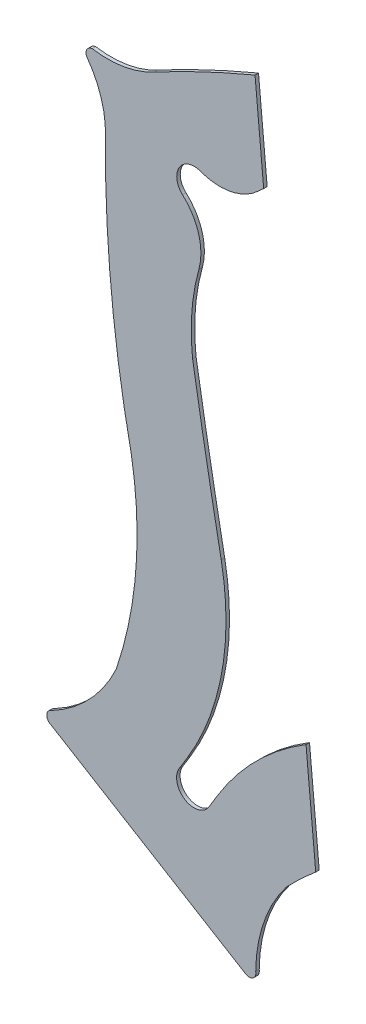
ISO-10303-21;
HEADER;
FILE_DESCRIPTION(('STEP AP214'),'2;1');
FILE_NAME('part.step','',(''),(''),'','','');
FILE_SCHEMA(('AUTOMOTIVE_DESIGN { 1 0 10303 214 1 1 1 1 }'));
ENDSEC;
DATA;
#1=APPLICATION_CONTEXT('core data for automotive mechanical design processes');
#2=APPLICATION_PROTOCOL_DEFINITION('international standard','automotive_design',2000,#1);
#3=PRODUCT_CONTEXT('',#1,'mechanical');
#4=PRODUCT('Part','Part','',(#3));
#5=PRODUCT_RELATED_PRODUCT_CATEGORY('part','',(#4));
#6=PRODUCT_DEFINITION_FORMATION('','',#4);
#7=PRODUCT_DEFINITION_CONTEXT('part definition',#1,'design');
#8=PRODUCT_DEFINITION('design','',#6,#7);
#9=PRODUCT_DEFINITION_SHAPE('','',#8);
#10=(LENGTH_UNIT() NAMED_UNIT(*) SI_UNIT(.MILLI.,.METRE.));
#11=(NAMED_UNIT(*) PLANE_ANGLE_UNIT() SI_UNIT($,.RADIAN.));
#12=(NAMED_UNIT(*) SI_UNIT($,.STERADIAN.) SOLID_ANGLE_UNIT());
#13=UNCERTAINTY_MEASURE_WITH_UNIT(LENGTH_MEASURE(1.E-05),#10,'distance_accuracy_value','');
#14=(GEOMETRIC_REPRESENTATION_CONTEXT(3) GLOBAL_UNCERTAINTY_ASSIGNED_CONTEXT((#13)) GLOBAL_UNIT_ASSIGNED_CONTEXT((#10,
#11,#12)) REPRESENTATION_CONTEXT('',''));
#15=CARTESIAN_POINT('',(0.,0.,0.));
#16=DIRECTION('',(0.,0.,1.));
#17=DIRECTION('',(1.,0.,0.));
#18=AXIS2_PLACEMENT_3D('',#15,#16,#17);
#19=CARTESIAN_POINT('',(-739.962312354849,864.313923100061,0.));
#20=DIRECTION('',(-0.995795754844476,-0.0916013899115097,0.));
#21=DIRECTION('',(0.0916013899115097,-0.995795754844476,0.));
#22=AXIS2_PLACEMENT_3D('',#19,#20,#21);
#23=PLANE('',#22);
#24=DIRECTION('',(0.0916013899115097,-0.995795754844476,0.));
#25=VECTOR('',#24,1.);
#26=CARTESIAN_POINT('',(-456.655661603026,-2215.50353829879,6.35));
#27=LINE('',#26,#25);
#28=CARTESIAN_POINT('',(-728.998263502241,745.124101702356,6.35));
#29=VERTEX_POINT('',#28);
#30=CARTESIAN_POINT('',(-713.283018643652,574.284181788008,6.35));
#31=VERTEX_POINT('',#30);
#32=EDGE_CURVE('E38',#29,#31,#27,.T.);
#33=ORIENTED_EDGE('',*,*,#32,.T.);
#34=DIRECTION('',(0.,0.,-1.));
#35=VECTOR('',#34,1.);
#36=CARTESIAN_POINT('',(-713.283018643652,574.284181788008,6.35));
#37=LINE('',#36,#35);
#38=CARTESIAN_POINT('',(-713.283018643652,574.284181788008,0.));
#39=VERTEX_POINT('',#38);
#40=EDGE_CURVE('E279',#31,#39,#37,.T.);
#41=ORIENTED_EDGE('',*,*,#40,.T.);
#42=DIRECTION('',(0.0916013899115097,-0.995795754844476,0.));
#43=VECTOR('',#42,1.);
#44=CARTESIAN_POINT('',(-456.655661603026,-2215.50353829879,0.));
#45=LINE('',#44,#43);
#46=CARTESIAN_POINT('',(-728.998263502241,745.124101702356,0.));
#47=VERTEX_POINT('',#46);
#48=EDGE_CURVE('E273',#47,#39,#45,.T.);
#49=ORIENTED_EDGE('',*,*,#48,.F.);
#50=DIRECTION('',(0.,0.,-1.));
#51=VECTOR('',#50,1.);
#52=CARTESIAN_POINT('',(-728.998263502241,745.124101702356,6.35));
#53=LINE('',#52,#51);
#54=EDGE_CURVE('E274',#29,#47,#53,.T.);
#55=ORIENTED_EDGE('',*,*,#54,.F.);
#56=EDGE_LOOP('',(#33,#41,#49,#55));
#57=FACE_BOUND('',#56,.T.);
#58=ADVANCED_FACE('F34',(#57),#23,.F.);
#59=DIRECTION('',(0.,0.,-1.));
#60=VECTOR('',#59,1.);
#61=CARTESIAN_POINT('',(-618.70012513447,-453.923402489224,6.35));
#62=LINE('',#61,#60);
#63=CARTESIAN_POINT('',(-618.70012513447,-453.923402489224,6.35));
#64=VERTEX_POINT('',#63);
#65=CARTESIAN_POINT('',(-618.70012513447,-453.923402489224,0.));
#66=VERTEX_POINT('',#65);
#67=EDGE_CURVE('E278',#64,#66,#62,.T.);
#68=ORIENTED_EDGE('',*,*,#67,.T.);
#69=CARTESIAN_POINT('',(-636.348651364475,-262.066843150134,0.));
#70=VERTEX_POINT('',#69);
#71=EDGE_CURVE('E269',#70,#66,#45,.T.);
#72=ORIENTED_EDGE('',*,*,#71,.F.);
#73=DIRECTION('',(0.,0.,-1.));
#74=VECTOR('',#73,1.);
#75=CARTESIAN_POINT('',(-636.348651364475,-262.066843150134,6.35));
#76=LINE('',#75,#74);
#77=CARTESIAN_POINT('',(-636.348651364475,-262.066843150134,6.35));
#78=VERTEX_POINT('',#77);
#79=EDGE_CURVE('E277',#78,#70,#76,.T.);
#80=ORIENTED_EDGE('',*,*,#79,.F.);
#81=EDGE_CURVE('E304',#78,#64,#27,.T.);
#82=ORIENTED_EDGE('',*,*,#81,.T.);
#83=EDGE_LOOP('',(#68,#72,#80,#82));
#84=FACE_BOUND('',#83,.T.);
#85=ADVANCED_FACE('F300',(#84),#23,.F.);
#86=CARTESIAN_POINT('',(-207.431628724102,-2192.57788542269,6.35));
#87=DIRECTION('',(0.,0.,1.));
#88=DIRECTION('',(1.,0.,0.));
#89=AXIS2_PLACEMENT_3D('',#86,#87,#88);
#90=PLANE('',#89);
#91=ORIENTED_EDGE('',*,*,#32,.F.);
#92=CARTESIAN_POINT('',(133.325416300086,-1313.66098101386,6.35));
#93=DIRECTION('',(0.,0.,1.));
#94=DIRECTION('',(1.,0.,0.));
#95=AXIS2_PLACEMENT_3D('',#92,#93,#94);
#96=CIRCLE('',#95,2232.08381239653);
#97=CARTESIAN_POINT('',(-911.783074918438,658.633719872796,6.35));
#98=VERTEX_POINT('',#97);
#99=EDGE_CURVE('E246',#29,#98,#96,.T.);
#100=ORIENTED_EDGE('',*,*,#99,.T.);
#101=CARTESIAN_POINT('',(-996.839321168972,810.981354850759,6.35));
#102=DIRECTION('',(0.,0.,1.));
#103=DIRECTION('',(1.,0.,0.));
#104=AXIS2_PLACEMENT_3D('',#101,#102,#103);
#105=CIRCLE('',#104,174.483142193193);
#106=CARTESIAN_POINT('',(-1024.65645219095,638.729869715459,6.35));
#107=VERTEX_POINT('',#106);
#108=EDGE_CURVE('E243',#107,#98,#105,.T.);
#109=ORIENTED_EDGE('',*,*,#108,.F.);
#110=CARTESIAN_POINT('',(-1023.99483334752,626.620052071916,6.35));
#111=DIRECTION('',(0.,0.,1.));
#112=DIRECTION('',(1.,0.,0.));
#113=AXIS2_PLACEMENT_3D('',#110,#111,#112);
#114=CIRCLE('',#113,12.1278779204713);
#115=CARTESIAN_POINT('',(-1035.05047795371,621.634257732548,6.35));
#116=VERTEX_POINT('',#115);
#117=EDGE_CURVE('E241',#107,#116,#114,.T.);
#118=ORIENTED_EDGE('',*,*,#117,.T.);
#119=CARTESIAN_POINT('',(-1175.17416784648,517.664461924223,6.35));
#120=DIRECTION('',(0.,0.,1.));
#121=DIRECTION('',(1.,0.,0.));
#122=AXIS2_PLACEMENT_3D('',#119,#120,#121);
#123=CIRCLE('',#122,174.48314219314);
#124=CARTESIAN_POINT('',(-1000.7746031747,512.264577492649,6.35));
#125=VERTEX_POINT('',#124);
#126=EDGE_CURVE('E238',#125,#116,#123,.T.);
#127=ORIENTED_EDGE('',*,*,#126,.F.);
#128=CARTESIAN_POINT('',(1231.21814330763,492.102107085529,6.35));
#129=DIRECTION('',(0.,0.,1.));
#130=DIRECTION('',(1.,0.,0.));
#131=AXIS2_PLACEMENT_3D('',#128,#129,#130);
#132=CIRCLE('',#131,2232.08381239653);
#133=CARTESIAN_POINT('',(-953.720096563446,35.7655717174525,6.35));
#134=VERTEX_POINT('',#133);
#135=EDGE_CURVE('E236',#125,#134,#132,.T.);
#136=ORIENTED_EDGE('',*,*,#135,.T.);
#137=CARTESIAN_POINT('',(-1658.19094115933,-86.004591368166,6.35));
#138=DIRECTION('',(0.,0.,1.));
#139=DIRECTION('',(1.,0.,0.));
#140=AXIS2_PLACEMENT_3D('',#137,#138,#139);
#141=CIRCLE('',#140,714.917578118992);
#142=CARTESIAN_POINT('',(-981.214754129463,-315.809695093059,6.35));
#143=VERTEX_POINT('',#142);
#144=EDGE_CURVE('E233',#143,#134,#141,.T.);
#145=ORIENTED_EDGE('',*,*,#144,.F.);
#146=CARTESIAN_POINT('',(-1222.97007830394,-204.138274591056,6.35));
#147=DIRECTION('',(0.,0.,1.));
#148=DIRECTION('',(1.,0.,0.));
#149=AXIS2_PLACEMENT_3D('',#146,#147,#148);
#150=CIRCLE('',#149,266.300850399774);
#151=CARTESIAN_POINT('',(-1098.78715106738,-439.711497828751,6.35));
#152=VERTEX_POINT('',#151);
#153=EDGE_CURVE('E230',#152,#143,#150,.T.);
#154=ORIENTED_EDGE('',*,*,#153,.F.);
#155=CARTESIAN_POINT('',(-1095.28795597589,-451.32360601648,6.35));
#156=DIRECTION('',(0.,0.,1.));
#157=DIRECTION('',(1.,0.,0.));
#158=AXIS2_PLACEMENT_3D('',#155,#156,#157);
#159=CIRCLE('',#158,12.1278779203895);
#160=CARTESIAN_POINT('',(-1101.58850118248,-461.686450845558,6.35));
#161=VERTEX_POINT('',#160);
#162=EDGE_CURVE('E228',#152,#161,#159,.T.);
#163=ORIENTED_EDGE('',*,*,#162,.T.);
#164=DIRECTION('',(-0.854464803909409,0.519509286615798,0.));
#165=VECTOR('',#164,1.);
#166=CARTESIAN_POINT('',(319.591326574975,-1325.75494739807,6.35));
#167=LINE('',#166,#165);
#168=CARTESIAN_POINT('',(-745.975005522224,-677.897244544948,6.35));
#169=VERTEX_POINT('',#168);
#170=EDGE_CURVE('E225',#169,#161,#167,.T.);
#171=ORIENTED_EDGE('',*,*,#170,.F.);
#172=CARTESIAN_POINT('',(-739.67446031566,-667.534399715851,6.35));
#173=DIRECTION('',(0.,0.,1.));
#174=DIRECTION('',(1.,0.,0.));
#175=AXIS2_PLACEMENT_3D('',#172,#173,#174);
#176=CIRCLE('',#175,12.1278779203901);
#177=CARTESIAN_POINT('',(-727.754774639131,-665.296875140651,6.35));
#178=VERTEX_POINT('',#177);
#179=EDGE_CURVE('E222',#169,#178,#176,.T.);
#180=ORIENTED_EDGE('',*,*,#179,.T.);
#181=CARTESIAN_POINT('',(-461.460244071831,-667.131517756655,6.35));
#182=DIRECTION('',(0.,0.,1.));
#183=DIRECTION('',(1.,0.,0.));
#184=AXIS2_PLACEMENT_3D('',#181,#182,#183);
#185=CIRCLE('',#184,266.300850399676);
#186=CARTESIAN_POINT('',(-671.863351560498,-503.893423909958,6.35));
#187=VERTEX_POINT('',#186);
#188=EDGE_CURVE('E219',#187,#178,#185,.T.);
#189=ORIENTED_EDGE('',*,*,#188,.F.);
#190=CARTESIAN_POINT('',(-156.283159372883,-999.155181900189,6.35));
#191=DIRECTION('',(0.,0.,1.));
#192=DIRECTION('',(1.,0.,0.));
#193=AXIS2_PLACEMENT_3D('',#190,#191,#192);
#194=CIRCLE('',#193,714.917578119185);
#195=EDGE_CURVE('E223',#64,#187,#194,.T.);
#196=ORIENTED_EDGE('',*,*,#195,.F.);
#197=ORIENTED_EDGE('',*,*,#81,.F.);
#198=CARTESIAN_POINT('',(-385.336392843579,-674.250790038151,6.35));
#199=DIRECTION('',(0.,0.,1.));
#200=DIRECTION('',(1.,0.,0.));
#201=AXIS2_PLACEMENT_3D('',#198,#199,#200);
#202=CIRCLE('',#201,482.599999999943);
#203=CARTESIAN_POINT('',(-797.70110720941,-423.53560831597,6.35));
#204=VERTEX_POINT('',#203);
#205=EDGE_CURVE('E127',#78,#204,#202,.T.);
#206=ORIENTED_EDGE('',*,*,#205,.T.);
#207=DIRECTION('',(0.519509286618739,0.854464803907621,0.));
#208=VECTOR('',#207,1.);
#209=CARTESIAN_POINT('',(-1423.67545112807,-1453.10920556371,6.35));
#210=LINE('',#209,#208);
#211=CARTESIAN_POINT('',(-812.645226406911,-448.115003157539,6.35));
#212=VERTEX_POINT('',#211);
#213=EDGE_CURVE('E267',#212,#204,#210,.T.);
#214=ORIENTED_EDGE('',*,*,#213,.F.);
#215=CARTESIAN_POINT('',(-839.774483931238,-431.62058330736,6.35));
#216=DIRECTION('',(0.,0.,1.));
#217=DIRECTION('',(1.,0.,0.));
#218=AXIS2_PLACEMENT_3D('',#215,#216,#217);
#219=CIRCLE('',#218,31.7500000002415);
#220=CARTESIAN_POINT('',(-866.903741455566,-415.126163457177,6.35));
#221=VERTEX_POINT('',#220);
#222=EDGE_CURVE('E265',#221,#212,#219,.T.);
#223=ORIENTED_EDGE('',*,*,#222,.F.);
#224=DIRECTION('',(0.519509286618293,0.854464803907892,0.));
#225=VECTOR('',#224,1.);
#226=CARTESIAN_POINT('',(-1477.9339661765,-1420.12036586415,6.35));
#227=LINE('',#226,#225);
#228=CARTESIAN_POINT('',(-851.959622259299,-390.546768617607,6.35));
#229=VERTEX_POINT('',#228);
#230=EDGE_CURVE('E198',#221,#229,#227,.T.);
#231=ORIENTED_EDGE('',*,*,#230,.T.);
#232=CARTESIAN_POINT('',(-1264.32433662576,-139.831586896463,6.35));
#233=DIRECTION('',(0.,0.,1.));
#234=DIRECTION('',(1.,0.,0.));
#235=AXIS2_PLACEMENT_3D('',#232,#233,#234);
#236=CIRCLE('',#235,482.599999999951);
#237=CARTESIAN_POINT('',(-790.433225391165,-48.5628918647749,6.35));
#238=VERTEX_POINT('',#237);
#239=EDGE_CURVE('E262',#229,#238,#236,.T.);
#240=ORIENTED_EDGE('',*,*,#239,.T.);
#241=CARTESIAN_POINT('',(10368.5226691678,2100.58765812371,6.35));
#242=DIRECTION('',(0.,0.,1.));
#243=DIRECTION('',(1.,0.,0.));
#244=AXIS2_PLACEMENT_3D('',#241,#242,#243);
#245=CIRCLE('',#244,11364.0285437528);
#246=CARTESIAN_POINT('',(-842.479661332079,241.939900006688,6.35));
#247=VERTEX_POINT('',#246);
#248=EDGE_CURVE('E259',#247,#238,#245,.T.);
#249=ORIENTED_EDGE('',*,*,#248,.F.);
#250=CARTESIAN_POINT('',(-464.693241697377,286.053261585415,6.35));
#251=DIRECTION('',(0.,0.,1.));
#252=DIRECTION('',(1.,0.,0.));
#253=AXIS2_PLACEMENT_3D('',#250,#251,#252);
#254=CIRCLE('',#253,380.353214170963);
#255=CARTESIAN_POINT('',(-831.063764439734,388.235488981742,6.35));
#256=VERTEX_POINT('',#255);
#257=EDGE_CURVE('E256',#256,#247,#254,.T.);
#258=ORIENTED_EDGE('',*,*,#257,.F.);
#259=CARTESIAN_POINT('',(-928.928706088083,415.530418843577,6.35));
#260=DIRECTION('',(0.,0.,1.));
#261=DIRECTION('',(1.,0.,0.));
#262=AXIS2_PLACEMENT_3D('',#259,#260,#261);
#263=CIRCLE('',#262,101.599999999991);
#264=CARTESIAN_POINT('',(-860.792890663928,490.896662324892,6.35));
#265=VERTEX_POINT('',#264);
#266=EDGE_CURVE('E254',#256,#265,#263,.T.);
#267=ORIENTED_EDGE('',*,*,#266,.T.);
#268=CARTESIAN_POINT('',(-839.500448343685,514.448613412956,6.35));
#269=DIRECTION('',(0.,0.,1.));
#270=DIRECTION('',(1.,0.,0.));
#271=AXIS2_PLACEMENT_3D('',#268,#269,#270);
#272=CIRCLE('',#271,31.7500000002426);
#273=CARTESIAN_POINT('',(-828.390125195344,544.191229632025,6.35));
#274=VERTEX_POINT('',#273);
#275=EDGE_CURVE('E250',#274,#265,#272,.T.);
#276=ORIENTED_EDGE('',*,*,#275,.F.);
#277=CARTESIAN_POINT('',(-792.837091120811,639.367601532275,6.35));
#278=DIRECTION('',(0.,0.,1.));
#279=DIRECTION('',(1.,0.,0.));
#280=AXIS2_PLACEMENT_3D('',#277,#278,#279);
#281=CIRCLE('',#280,101.6);
#282=CARTESIAN_POINT('',(-723.565098096971,565.044314585954,6.35));
#283=VERTEX_POINT('',#282);
#284=EDGE_CURVE('E247',#274,#283,#281,.T.);
#285=ORIENTED_EDGE('',*,*,#284,.T.);
#286=CARTESIAN_POINT('',(-464.236109922188,286.805130748695,6.35));
#287=DIRECTION('',(0.,0.,1.));
#288=DIRECTION('',(1.,0.,0.));
#289=AXIS2_PLACEMENT_3D('',#286,#287,#288);
#290=CIRCLE('',#289,380.353214170961);
#291=EDGE_CURVE('E251',#31,#283,#290,.T.);
#292=ORIENTED_EDGE('',*,*,#291,.F.);
#293=EDGE_LOOP('',(#91,#100,#109,#118,#127,#136,#145,#154,#163,#171,#180,#189,#196,#197,#206,
#214,#223,#231,#240,#249,#258,#267,#276,#285,#292));
#294=FACE_BOUND('',#293,.T.);
#295=ADVANCED_FACE('F459',(#294),#90,.T.);
#296=CARTESIAN_POINT('',(-207.431628724102,-2192.57788542269,0.));
#297=DIRECTION('',(0.,0.,1.));
#298=DIRECTION('',(1.,0.,0.));
#299=AXIS2_PLACEMENT_3D('',#296,#297,#298);
#300=PLANE('',#299);
#301=CARTESIAN_POINT('',(133.325416300086,-1313.66098101386,0.));
#302=DIRECTION('',(0.,0.,1.));
#303=DIRECTION('',(1.,0.,0.));
#304=AXIS2_PLACEMENT_3D('',#301,#302,#303);
#305=CIRCLE('',#304,2232.08381239653);
#306=CARTESIAN_POINT('',(-911.783074918438,658.633719872796,0.));
#307=VERTEX_POINT('',#306);
#308=EDGE_CURVE('E284',#47,#307,#305,.T.);
#309=ORIENTED_EDGE('',*,*,#308,.F.);
#310=ORIENTED_EDGE('',*,*,#48,.T.);
#311=CARTESIAN_POINT('',(-464.236109922188,286.805130748695,0.));
#312=DIRECTION('',(0.,0.,1.));
#313=DIRECTION('',(1.,0.,0.));
#314=AXIS2_PLACEMENT_3D('',#311,#312,#313);
#315=CIRCLE('',#314,380.353214170961);
#316=CARTESIAN_POINT('',(-723.565098096971,565.044314585954,0.));
#317=VERTEX_POINT('',#316);
#318=EDGE_CURVE('E286',#39,#317,#315,.T.);
#319=ORIENTED_EDGE('',*,*,#318,.T.);
#320=CARTESIAN_POINT('',(-792.837091120811,639.367601532275,0.));
#321=DIRECTION('',(0.,0.,1.));
#322=DIRECTION('',(1.,0.,0.));
#323=AXIS2_PLACEMENT_3D('',#320,#321,#322);
#324=CIRCLE('',#323,101.6);
#325=CARTESIAN_POINT('',(-828.390125195344,544.191229632025,0.));
#326=VERTEX_POINT('',#325);
#327=EDGE_CURVE('E288',#326,#317,#324,.T.);
#328=ORIENTED_EDGE('',*,*,#327,.F.);
#329=CARTESIAN_POINT('',(-839.500448343685,514.448613412956,0.));
#330=DIRECTION('',(0.,0.,1.));
#331=DIRECTION('',(1.,0.,0.));
#332=AXIS2_PLACEMENT_3D('',#329,#330,#331);
#333=CIRCLE('',#332,31.7500000002426);
#334=CARTESIAN_POINT('',(-860.792890663928,490.896662324892,0.));
#335=VERTEX_POINT('',#334);
#336=EDGE_CURVE('E352',#326,#335,#333,.T.);
#337=ORIENTED_EDGE('',*,*,#336,.T.);
#338=CARTESIAN_POINT('',(-928.928706088083,415.530418843577,0.));
#339=DIRECTION('',(0.,0.,1.));
#340=DIRECTION('',(1.,0.,0.));
#341=AXIS2_PLACEMENT_3D('',#338,#339,#340);
#342=CIRCLE('',#341,101.599999999991);
#343=CARTESIAN_POINT('',(-831.063764439734,388.235488981742,0.));
#344=VERTEX_POINT('',#343);
#345=EDGE_CURVE('E355',#344,#335,#342,.T.);
#346=ORIENTED_EDGE('',*,*,#345,.F.);
#347=CARTESIAN_POINT('',(-464.693241697377,286.053261585415,0.));
#348=DIRECTION('',(0.,0.,1.));
#349=DIRECTION('',(1.,0.,0.));
#350=AXIS2_PLACEMENT_3D('',#347,#348,#349);
#351=CIRCLE('',#350,380.353214170963);
#352=CARTESIAN_POINT('',(-842.479661332079,241.939900006688,0.));
#353=VERTEX_POINT('',#352);
#354=EDGE_CURVE('E358',#344,#353,#351,.T.);
#355=ORIENTED_EDGE('',*,*,#354,.T.);
#356=CARTESIAN_POINT('',(10368.5226691678,2100.58765812371,0.));
#357=DIRECTION('',(0.,0.,1.));
#358=DIRECTION('',(1.,0.,0.));
#359=AXIS2_PLACEMENT_3D('',#356,#357,#358);
#360=CIRCLE('',#359,11364.0285437528);
#361=CARTESIAN_POINT('',(-790.433225391165,-48.5628918647749,0.));
#362=VERTEX_POINT('',#361);
#363=EDGE_CURVE('E361',#353,#362,#360,.T.);
#364=ORIENTED_EDGE('',*,*,#363,.T.);
#365=CARTESIAN_POINT('',(-1264.32433662576,-139.831586896463,0.));
#366=DIRECTION('',(0.,0.,1.));
#367=DIRECTION('',(1.,0.,0.));
#368=AXIS2_PLACEMENT_3D('',#365,#366,#367);
#369=CIRCLE('',#368,482.599999999951);
#370=CARTESIAN_POINT('',(-851.959622259299,-390.546768617607,0.));
#371=VERTEX_POINT('',#370);
#372=EDGE_CURVE('E212',#371,#362,#369,.T.);
#373=ORIENTED_EDGE('',*,*,#372,.F.);
#374=DIRECTION('',(0.519509286618293,0.854464803907892,0.));
#375=VECTOR('',#374,1.);
#376=CARTESIAN_POINT('',(-1477.9339661765,-1420.12036586415,0.));
#377=LINE('',#376,#375);
#378=CARTESIAN_POINT('',(-866.903741455566,-415.126163457177,0.));
#379=VERTEX_POINT('',#378);
#380=EDGE_CURVE('E196',#379,#371,#377,.T.);
#381=ORIENTED_EDGE('',*,*,#380,.F.);
#382=CARTESIAN_POINT('',(-839.774483931238,-431.62058330736,0.));
#383=DIRECTION('',(0.,0.,1.));
#384=DIRECTION('',(1.,0.,0.));
#385=AXIS2_PLACEMENT_3D('',#382,#383,#384);
#386=CIRCLE('',#385,31.7500000002415);
#387=CARTESIAN_POINT('',(-812.645226406911,-448.115003157539,0.));
#388=VERTEX_POINT('',#387);
#389=EDGE_CURVE('E209',#379,#388,#386,.T.);
#390=ORIENTED_EDGE('',*,*,#389,.T.);
#391=DIRECTION('',(0.519509286618739,0.854464803907621,0.));
#392=VECTOR('',#391,1.);
#393=CARTESIAN_POINT('',(-1423.67545112807,-1453.10920556371,0.));
#394=LINE('',#393,#392);
#395=CARTESIAN_POINT('',(-797.70110720941,-423.53560831597,0.));
#396=VERTEX_POINT('',#395);
#397=EDGE_CURVE('E44',#388,#396,#394,.T.);
#398=ORIENTED_EDGE('',*,*,#397,.T.);
#399=CARTESIAN_POINT('',(-385.336392843579,-674.250790038151,0.));
#400=DIRECTION('',(0.,0.,1.));
#401=DIRECTION('',(1.,0.,0.));
#402=AXIS2_PLACEMENT_3D('',#399,#400,#401);
#403=CIRCLE('',#402,482.599999999943);
#404=EDGE_CURVE('E11',#70,#396,#403,.T.);
#405=ORIENTED_EDGE('',*,*,#404,.F.);
#406=ORIENTED_EDGE('',*,*,#71,.T.);
#407=CARTESIAN_POINT('',(-156.283159372883,-999.155181900189,0.));
#408=DIRECTION('',(0.,0.,1.));
#409=DIRECTION('',(1.,0.,0.));
#410=AXIS2_PLACEMENT_3D('',#407,#408,#409);
#411=CIRCLE('',#410,714.917578119185);
#412=CARTESIAN_POINT('',(-671.863351560498,-503.893423909958,0.));
#413=VERTEX_POINT('',#412);
#414=EDGE_CURVE('E135',#66,#413,#411,.T.);
#415=ORIENTED_EDGE('',*,*,#414,.T.);
#416=CARTESIAN_POINT('',(-461.460244071831,-667.131517756655,0.));
#417=DIRECTION('',(0.,0.,1.));
#418=DIRECTION('',(1.,0.,0.));
#419=AXIS2_PLACEMENT_3D('',#416,#417,#418);
#420=CIRCLE('',#419,266.300850399676);
#421=CARTESIAN_POINT('',(-727.754774639131,-665.296875140651,0.));
#422=VERTEX_POINT('',#421);
#423=EDGE_CURVE('E291',#413,#422,#420,.T.);
#424=ORIENTED_EDGE('',*,*,#423,.T.);
#425=CARTESIAN_POINT('',(-739.67446031566,-667.534399715851,0.));
#426=DIRECTION('',(0.,0.,1.));
#427=DIRECTION('',(1.,0.,0.));
#428=AXIS2_PLACEMENT_3D('',#425,#426,#427);
#429=CIRCLE('',#428,12.1278779203901);
#430=CARTESIAN_POINT('',(-745.975005522224,-677.897244544948,0.));
#431=VERTEX_POINT('',#430);
#432=EDGE_CURVE('E322',#431,#422,#429,.T.);
#433=ORIENTED_EDGE('',*,*,#432,.F.);
#434=DIRECTION('',(-0.854464803909409,0.519509286615798,0.));
#435=VECTOR('',#434,1.);
#436=CARTESIAN_POINT('',(319.591326574975,-1325.75494739807,0.));
#437=LINE('',#436,#435);
#438=CARTESIAN_POINT('',(-1101.58850118248,-461.686450845558,0.));
#439=VERTEX_POINT('',#438);
#440=EDGE_CURVE('E324',#431,#439,#437,.T.);
#441=ORIENTED_EDGE('',*,*,#440,.T.);
#442=CARTESIAN_POINT('',(-1095.28795597589,-451.32360601648,0.));
#443=DIRECTION('',(0.,0.,1.));
#444=DIRECTION('',(1.,0.,0.));
#445=AXIS2_PLACEMENT_3D('',#442,#443,#444);
#446=CIRCLE('',#445,12.1278779203895);
#447=CARTESIAN_POINT('',(-1098.78715106738,-439.711497828751,0.));
#448=VERTEX_POINT('',#447);
#449=EDGE_CURVE('E330',#448,#439,#446,.T.);
#450=ORIENTED_EDGE('',*,*,#449,.F.);
#451=CARTESIAN_POINT('',(-1222.97007830394,-204.138274591056,0.));
#452=DIRECTION('',(0.,0.,1.));
#453=DIRECTION('',(1.,0.,0.));
#454=AXIS2_PLACEMENT_3D('',#451,#452,#453);
#455=CIRCLE('',#454,266.300850399774);
#456=CARTESIAN_POINT('',(-981.214754129463,-315.809695093059,0.));
#457=VERTEX_POINT('',#456);
#458=EDGE_CURVE('E333',#448,#457,#455,.T.);
#459=ORIENTED_EDGE('',*,*,#458,.T.);
#460=CARTESIAN_POINT('',(-1658.19094115933,-86.004591368166,0.));
#461=DIRECTION('',(0.,0.,1.));
#462=DIRECTION('',(1.,0.,0.));
#463=AXIS2_PLACEMENT_3D('',#460,#461,#462);
#464=CIRCLE('',#463,714.917578118992);
#465=CARTESIAN_POINT('',(-953.720096563446,35.7655717174525,0.));
#466=VERTEX_POINT('',#465);
#467=EDGE_CURVE('E336',#457,#466,#464,.T.);
#468=ORIENTED_EDGE('',*,*,#467,.T.);
#469=CARTESIAN_POINT('',(1231.21814330763,492.102107085529,0.));
#470=DIRECTION('',(0.,0.,1.));
#471=DIRECTION('',(1.,0.,0.));
#472=AXIS2_PLACEMENT_3D('',#469,#470,#471);
#473=CIRCLE('',#472,2232.08381239653);
#474=CARTESIAN_POINT('',(-1000.7746031747,512.264577492649,0.));
#475=VERTEX_POINT('',#474);
#476=EDGE_CURVE('E339',#475,#466,#473,.T.);
#477=ORIENTED_EDGE('',*,*,#476,.F.);
#478=CARTESIAN_POINT('',(-1175.17416784648,517.664461924223,0.));
#479=DIRECTION('',(0.,0.,1.));
#480=DIRECTION('',(1.,0.,0.));
#481=AXIS2_PLACEMENT_3D('',#478,#479,#480);
#482=CIRCLE('',#481,174.48314219314);
#483=CARTESIAN_POINT('',(-1035.05047795371,621.634257732548,0.));
#484=VERTEX_POINT('',#483);
#485=EDGE_CURVE('E342',#475,#484,#482,.T.);
#486=ORIENTED_EDGE('',*,*,#485,.T.);
#487=CARTESIAN_POINT('',(-1023.99483334752,626.620052071916,0.));
#488=DIRECTION('',(0.,0.,1.));
#489=DIRECTION('',(1.,0.,0.));
#490=AXIS2_PLACEMENT_3D('',#487,#488,#489);
#491=CIRCLE('',#490,12.1278779204713);
#492=CARTESIAN_POINT('',(-1024.65645219095,638.729869715459,0.));
#493=VERTEX_POINT('',#492);
#494=EDGE_CURVE('E345',#493,#484,#491,.T.);
#495=ORIENTED_EDGE('',*,*,#494,.F.);
#496=CARTESIAN_POINT('',(-996.839321168972,810.981354850759,0.));
#497=DIRECTION('',(0.,0.,1.));
#498=DIRECTION('',(1.,0.,0.));
#499=AXIS2_PLACEMENT_3D('',#496,#497,#498);
#500=CIRCLE('',#499,174.483142193193);
#501=EDGE_CURVE('E287',#493,#307,#500,.T.);
#502=ORIENTED_EDGE('',*,*,#501,.T.);
#503=EDGE_LOOP('',(#309,#310,#319,#328,#337,#346,#355,#364,#373,#381,#390,#398,#405,#406,#415,
#424,#433,#441,#450,#459,#468,#477,#486,#495,#502));
#504=FACE_BOUND('',#503,.T.);
#505=ADVANCED_FACE('F36',(#504),#300,.F.);
#506=CARTESIAN_POINT('',(133.325416300086,-1313.66098101386,6.35));
#507=DIRECTION('',(0.,0.,-1.));
#508=DIRECTION('',(-1.,0.,0.));
#509=AXIS2_PLACEMENT_3D('',#506,#507,#508);
#510=CYLINDRICAL_SURFACE('',#509,2232.08381239653);
#511=ORIENTED_EDGE('',*,*,#99,.F.);
#512=ORIENTED_EDGE('',*,*,#54,.T.);
#513=ORIENTED_EDGE('',*,*,#308,.T.);
#514=DIRECTION('',(0.,0.,-1.));
#515=VECTOR('',#514,1.);
#516=CARTESIAN_POINT('',(-911.783074918438,658.633719872796,6.35));
#517=LINE('',#516,#515);
#518=EDGE_CURVE('E272',#98,#307,#517,.T.);
#519=ORIENTED_EDGE('',*,*,#518,.F.);
#520=EDGE_LOOP('',(#511,#512,#513,#519));
#521=FACE_BOUND('',#520,.T.);
#522=ADVANCED_FACE('F443',(#521),#510,.T.);
#523=CARTESIAN_POINT('',(-996.839321168972,810.981354850759,6.35));
#524=DIRECTION('',(0.,0.,-1.));
#525=DIRECTION('',(-1.,0.,0.));
#526=AXIS2_PLACEMENT_3D('',#523,#524,#525);
#527=CYLINDRICAL_SURFACE('',#526,174.483142193193);
#528=ORIENTED_EDGE('',*,*,#501,.F.);
#529=DIRECTION('',(0.,0.,-1.));
#530=VECTOR('',#529,1.);
#531=CARTESIAN_POINT('',(-1024.65645219095,638.729869715459,6.35));
#532=LINE('',#531,#530);
#533=EDGE_CURVE('E388',#107,#493,#532,.T.);
#534=ORIENTED_EDGE('',*,*,#533,.F.);
#535=ORIENTED_EDGE('',*,*,#108,.T.);
#536=ORIENTED_EDGE('',*,*,#518,.T.);
#537=EDGE_LOOP('',(#528,#534,#535,#536));
#538=FACE_BOUND('',#537,.T.);
#539=ADVANCED_FACE('F438',(#538),#527,.F.);
#540=CARTESIAN_POINT('',(-1023.99483334752,626.620052071916,6.35));
#541=DIRECTION('',(0.,0.,-1.));
#542=DIRECTION('',(-1.,0.,0.));
#543=AXIS2_PLACEMENT_3D('',#540,#541,#542);
#544=CYLINDRICAL_SURFACE('',#543,12.1278779204713);
#545=ORIENTED_EDGE('',*,*,#494,.T.);
#546=DIRECTION('',(0.,0.,-1.));
#547=VECTOR('',#546,1.);
#548=CARTESIAN_POINT('',(-1035.05047795371,621.634257732548,6.35));
#549=LINE('',#548,#547);
#550=EDGE_CURVE('E390',#116,#484,#549,.T.);
#551=ORIENTED_EDGE('',*,*,#550,.F.);
#552=ORIENTED_EDGE('',*,*,#117,.F.);
#553=ORIENTED_EDGE('',*,*,#533,.T.);
#554=EDGE_LOOP('',(#545,#551,#552,#553));
#555=FACE_BOUND('',#554,.T.);
#556=ADVANCED_FACE('F435',(#555),#544,.T.);
#557=CARTESIAN_POINT('',(-1175.17416784648,517.664461924223,6.35));
#558=DIRECTION('',(0.,0.,-1.));
#559=DIRECTION('',(-1.,0.,0.));
#560=AXIS2_PLACEMENT_3D('',#557,#558,#559);
#561=CYLINDRICAL_SURFACE('',#560,174.48314219314);
#562=ORIENTED_EDGE('',*,*,#485,.F.);
#563=DIRECTION('',(0.,0.,-1.));
#564=VECTOR('',#563,1.);
#565=CARTESIAN_POINT('',(-1000.7746031747,512.264577492649,6.35));
#566=LINE('',#565,#564);
#567=EDGE_CURVE('E392',#125,#475,#566,.T.);
#568=ORIENTED_EDGE('',*,*,#567,.F.);
#569=ORIENTED_EDGE('',*,*,#126,.T.);
#570=ORIENTED_EDGE('',*,*,#550,.T.);
#571=EDGE_LOOP('',(#562,#568,#569,#570));
#572=FACE_BOUND('',#571,.T.);
#573=ADVANCED_FACE('F429',(#572),#561,.F.);
#574=CARTESIAN_POINT('',(1231.21814330763,492.102107085529,6.35));
#575=DIRECTION('',(0.,0.,-1.));
#576=DIRECTION('',(-1.,0.,0.));
#577=AXIS2_PLACEMENT_3D('',#574,#575,#576);
#578=CYLINDRICAL_SURFACE('',#577,2232.08381239653);
#579=ORIENTED_EDGE('',*,*,#476,.T.);
#580=DIRECTION('',(0.,0.,-1.));
#581=VECTOR('',#580,1.);
#582=CARTESIAN_POINT('',(-953.720096563446,35.7655717174525,6.35));
#583=LINE('',#582,#581);
#584=EDGE_CURVE('E394',#134,#466,#583,.T.);
#585=ORIENTED_EDGE('',*,*,#584,.F.);
#586=ORIENTED_EDGE('',*,*,#135,.F.);
#587=ORIENTED_EDGE('',*,*,#567,.T.);
#588=EDGE_LOOP('',(#579,#585,#586,#587));
#589=FACE_BOUND('',#588,.T.);
#590=ADVANCED_FACE('F531',(#589),#578,.T.);
#591=CARTESIAN_POINT('',(-1658.19094115933,-86.004591368166,6.35));
#592=DIRECTION('',(0.,0.,-1.));
#593=DIRECTION('',(-1.,0.,0.));
#594=AXIS2_PLACEMENT_3D('',#591,#592,#593);
#595=CYLINDRICAL_SURFACE('',#594,714.917578118992);
#596=ORIENTED_EDGE('',*,*,#467,.F.);
#597=DIRECTION('',(0.,0.,-1.));
#598=VECTOR('',#597,1.);
#599=CARTESIAN_POINT('',(-981.214754129463,-315.809695093059,6.35));
#600=LINE('',#599,#598);
#601=EDGE_CURVE('E396',#143,#457,#600,.T.);
#602=ORIENTED_EDGE('',*,*,#601,.F.);
#603=ORIENTED_EDGE('',*,*,#144,.T.);
#604=ORIENTED_EDGE('',*,*,#584,.T.);
#605=EDGE_LOOP('',(#596,#602,#603,#604));
#606=FACE_BOUND('',#605,.T.);
#607=ADVANCED_FACE('F422',(#606),#595,.F.);
#608=CARTESIAN_POINT('',(-1222.97007830394,-204.138274591056,6.35));
#609=DIRECTION('',(0.,0.,-1.));
#610=DIRECTION('',(-1.,0.,0.));
#611=AXIS2_PLACEMENT_3D('',#608,#609,#610);
#612=CYLINDRICAL_SURFACE('',#611,266.300850399774);
#613=ORIENTED_EDGE('',*,*,#458,.F.);
#614=DIRECTION('',(0.,0.,-1.));
#615=VECTOR('',#614,1.);
#616=CARTESIAN_POINT('',(-1098.78715106738,-439.711497828751,6.35));
#617=LINE('',#616,#615);
#618=EDGE_CURVE('E398',#152,#448,#617,.T.);
#619=ORIENTED_EDGE('',*,*,#618,.F.);
#620=ORIENTED_EDGE('',*,*,#153,.T.);
#621=ORIENTED_EDGE('',*,*,#601,.T.);
#622=EDGE_LOOP('',(#613,#619,#620,#621));
#623=FACE_BOUND('',#622,.T.);
#624=ADVANCED_FACE('F417',(#623),#612,.F.);
#625=CARTESIAN_POINT('',(-1095.28795597589,-451.32360601648,6.35));
#626=DIRECTION('',(0.,0.,-1.));
#627=DIRECTION('',(-1.,0.,0.));
#628=AXIS2_PLACEMENT_3D('',#625,#626,#627);
#629=CYLINDRICAL_SURFACE('',#628,12.1278779203895);
#630=ORIENTED_EDGE('',*,*,#449,.T.);
#631=DIRECTION('',(0.,0.,-1.));
#632=VECTOR('',#631,1.);
#633=CARTESIAN_POINT('',(-1101.58850118248,-461.686450845558,6.35));
#634=LINE('',#633,#632);
#635=EDGE_CURVE('E400',#161,#439,#634,.T.);
#636=ORIENTED_EDGE('',*,*,#635,.F.);
#637=ORIENTED_EDGE('',*,*,#162,.F.);
#638=ORIENTED_EDGE('',*,*,#618,.T.);
#639=EDGE_LOOP('',(#630,#636,#637,#638));
#640=FACE_BOUND('',#639,.T.);
#641=ADVANCED_FACE('F414',(#640),#629,.T.);
#642=CARTESIAN_POINT('',(319.591326574975,-1325.75494739807,6.35));
#643=DIRECTION('',(-0.519509286615798,-0.854464803909409,0.));
#644=DIRECTION('',(0.854464803909409,-0.519509286615798,0.));
#645=AXIS2_PLACEMENT_3D('',#642,#643,#644);
#646=PLANE('',#645);
#647=ORIENTED_EDGE('',*,*,#440,.F.);
#648=DIRECTION('',(0.,0.,-1.));
#649=VECTOR('',#648,1.);
#650=CARTESIAN_POINT('',(-745.975005522224,-677.897244544948,6.35));
#651=LINE('',#650,#649);
#652=EDGE_CURVE('E402',#169,#431,#651,.T.);
#653=ORIENTED_EDGE('',*,*,#652,.F.);
#654=ORIENTED_EDGE('',*,*,#170,.T.);
#655=ORIENTED_EDGE('',*,*,#635,.T.);
#656=EDGE_LOOP('',(#647,#653,#654,#655));
#657=FACE_BOUND('',#656,.T.);
#658=ADVANCED_FACE('F410',(#657),#646,.T.);
#659=CARTESIAN_POINT('',(-739.67446031566,-667.534399715851,6.35));
#660=DIRECTION('',(0.,0.,-1.));
#661=DIRECTION('',(-1.,0.,0.));
#662=AXIS2_PLACEMENT_3D('',#659,#660,#661);
#663=CYLINDRICAL_SURFACE('',#662,12.1278779203901);
#664=ORIENTED_EDGE('',*,*,#432,.T.);
#665=DIRECTION('',(0.,0.,-1.));
#666=VECTOR('',#665,1.);
#667=CARTESIAN_POINT('',(-727.754774639131,-665.296875140651,6.35));
#668=LINE('',#667,#666);
#669=EDGE_CURVE('E316',#178,#422,#668,.T.);
#670=ORIENTED_EDGE('',*,*,#669,.F.);
#671=ORIENTED_EDGE('',*,*,#179,.F.);
#672=ORIENTED_EDGE('',*,*,#652,.T.);
#673=EDGE_LOOP('',(#664,#670,#671,#672));
#674=FACE_BOUND('',#673,.T.);
#675=ADVANCED_FACE('F405',(#674),#663,.T.);
#676=CARTESIAN_POINT('',(-461.460244071831,-667.131517756655,6.35));
#677=DIRECTION('',(0.,0.,-1.));
#678=DIRECTION('',(-1.,0.,0.));
#679=AXIS2_PLACEMENT_3D('',#676,#677,#678);
#680=CYLINDRICAL_SURFACE('',#679,266.300850399676);
#681=ORIENTED_EDGE('',*,*,#423,.F.);
#682=DIRECTION('',(0.,0.,-1.));
#683=VECTOR('',#682,1.);
#684=CARTESIAN_POINT('',(-671.863351560498,-503.893423909958,6.35));
#685=LINE('',#684,#683);
#686=EDGE_CURVE('E311',#187,#413,#685,.T.);
#687=ORIENTED_EDGE('',*,*,#686,.F.);
#688=ORIENTED_EDGE('',*,*,#188,.T.);
#689=ORIENTED_EDGE('',*,*,#669,.T.);
#690=EDGE_LOOP('',(#681,#687,#688,#689));
#691=FACE_BOUND('',#690,.T.);
#692=ADVANCED_FACE('F318',(#691),#680,.F.);
#693=CARTESIAN_POINT('',(-156.283159372883,-999.155181900189,6.35));
#694=DIRECTION('',(0.,0.,-1.));
#695=DIRECTION('',(-1.,0.,0.));
#696=AXIS2_PLACEMENT_3D('',#693,#694,#695);
#697=CYLINDRICAL_SURFACE('',#696,714.917578119185);
#698=ORIENTED_EDGE('',*,*,#67,.F.);
#699=ORIENTED_EDGE('',*,*,#195,.T.);
#700=ORIENTED_EDGE('',*,*,#686,.T.);
#701=ORIENTED_EDGE('',*,*,#414,.F.);
#702=EDGE_LOOP('',(#698,#699,#700,#701));
#703=FACE_BOUND('',#702,.T.);
#704=ADVANCED_FACE('F309',(#703),#697,.F.);
#705=CARTESIAN_POINT('',(-385.336392843579,-674.250790038151,6.35));
#706=DIRECTION('',(0.,0.,-1.));
#707=DIRECTION('',(-1.,0.,0.));
#708=AXIS2_PLACEMENT_3D('',#705,#706,#707);
#709=CYLINDRICAL_SURFACE('',#708,482.599999999943);
#710=ORIENTED_EDGE('',*,*,#205,.F.);
#711=ORIENTED_EDGE('',*,*,#79,.T.);
#712=ORIENTED_EDGE('',*,*,#404,.T.);
#713=DIRECTION('',(0.,0.,-1.));
#714=VECTOR('',#713,1.);
#715=CARTESIAN_POINT('',(-797.70110720941,-423.53560831597,6.35));
#716=LINE('',#715,#714);
#717=EDGE_CURVE('E315',#204,#396,#716,.T.);
#718=ORIENTED_EDGE('',*,*,#717,.F.);
#719=EDGE_LOOP('',(#710,#711,#712,#718));
#720=FACE_BOUND('',#719,.T.);
#721=ADVANCED_FACE('F451',(#720),#709,.T.);
#722=CARTESIAN_POINT('',(-1423.67545112807,-1453.10920556371,6.35));
#723=DIRECTION('',(-0.854464803907621,0.519509286618739,0.));
#724=DIRECTION('',(-0.519509286618739,-0.854464803907621,0.));
#725=AXIS2_PLACEMENT_3D('',#722,#723,#724);
#726=PLANE('',#725);
#727=ORIENTED_EDGE('',*,*,#397,.F.);
#728=DIRECTION('',(0.,0.,-1.));
#729=VECTOR('',#728,1.);
#730=CARTESIAN_POINT('',(-812.645226406911,-448.115003157539,6.35));
#731=LINE('',#730,#729);
#732=EDGE_CURVE('E120',#212,#388,#731,.T.);
#733=ORIENTED_EDGE('',*,*,#732,.F.);
#734=ORIENTED_EDGE('',*,*,#213,.T.);
#735=ORIENTED_EDGE('',*,*,#717,.T.);
#736=EDGE_LOOP('',(#727,#733,#734,#735));
#737=FACE_BOUND('',#736,.T.);
#738=ADVANCED_FACE('F457',(#737),#726,.T.);
#739=CARTESIAN_POINT('',(-839.774483931238,-431.62058330736,6.35));
#740=DIRECTION('',(0.,0.,-1.));
#741=DIRECTION('',(-1.,0.,0.));
#742=AXIS2_PLACEMENT_3D('',#739,#740,#741);
#743=CYLINDRICAL_SURFACE('',#742,31.7500000002415);
#744=ORIENTED_EDGE('',*,*,#389,.F.);
#745=DIRECTION('',(0.,0.,-1.));
#746=VECTOR('',#745,1.);
#747=CARTESIAN_POINT('',(-866.903741455566,-415.126163457177,6.35));
#748=LINE('',#747,#746);
#749=EDGE_CURVE('E192',#221,#379,#748,.T.);
#750=ORIENTED_EDGE('',*,*,#749,.F.);
#751=ORIENTED_EDGE('',*,*,#222,.T.);
#752=ORIENTED_EDGE('',*,*,#732,.T.);
#753=EDGE_LOOP('',(#744,#750,#751,#752));
#754=FACE_BOUND('',#753,.T.);
#755=ADVANCED_FACE('F214',(#754),#743,.F.);
#756=CARTESIAN_POINT('',(-1477.9339661765,-1420.12036586415,6.35));
#757=DIRECTION('',(-0.854464803907892,0.519509286618293,0.));
#758=DIRECTION('',(-0.519509286618293,-0.854464803907892,0.));
#759=AXIS2_PLACEMENT_3D('',#756,#757,#758);
#760=PLANE('',#759);
#761=ORIENTED_EDGE('',*,*,#380,.T.);
#762=DIRECTION('',(0.,0.,-1.));
#763=VECTOR('',#762,1.);
#764=CARTESIAN_POINT('',(-851.959622259299,-390.546768617607,6.35));
#765=LINE('',#764,#763);
#766=EDGE_CURVE('E203',#229,#371,#765,.T.);
#767=ORIENTED_EDGE('',*,*,#766,.F.);
#768=ORIENTED_EDGE('',*,*,#230,.F.);
#769=ORIENTED_EDGE('',*,*,#749,.T.);
#770=EDGE_LOOP('',(#761,#767,#768,#769));
#771=FACE_BOUND('',#770,.T.);
#772=ADVANCED_FACE('F194',(#771),#760,.F.);
#773=CARTESIAN_POINT('',(-1264.32433662576,-139.831586896463,6.35));
#774=DIRECTION('',(0.,0.,-1.));
#775=DIRECTION('',(-1.,0.,0.));
#776=AXIS2_PLACEMENT_3D('',#773,#774,#775);
#777=CYLINDRICAL_SURFACE('',#776,482.599999999951);
#778=ORIENTED_EDGE('',*,*,#372,.T.);
#779=DIRECTION('',(0.,0.,-1.));
#780=VECTOR('',#779,1.);
#781=CARTESIAN_POINT('',(-790.433225391165,-48.5628918647749,6.35));
#782=LINE('',#781,#780);
#783=EDGE_CURVE('E366',#238,#362,#782,.T.);
#784=ORIENTED_EDGE('',*,*,#783,.F.);
#785=ORIENTED_EDGE('',*,*,#239,.F.);
#786=ORIENTED_EDGE('',*,*,#766,.T.);
#787=EDGE_LOOP('',(#778,#784,#785,#786));
#788=FACE_BOUND('',#787,.T.);
#789=ADVANCED_FACE('F364',(#788),#777,.T.);
#790=CARTESIAN_POINT('',(10368.5226691678,2100.58765812371,6.35));
#791=DIRECTION('',(0.,0.,-1.));
#792=DIRECTION('',(-1.,0.,0.));
#793=AXIS2_PLACEMENT_3D('',#790,#791,#792);
#794=CYLINDRICAL_SURFACE('',#793,11364.0285437528);
#795=ORIENTED_EDGE('',*,*,#363,.F.);
#796=DIRECTION('',(0.,0.,-1.));
#797=VECTOR('',#796,1.);
#798=CARTESIAN_POINT('',(-842.479661332079,241.939900006688,6.35));
#799=LINE('',#798,#797);
#800=EDGE_CURVE('E372',#247,#353,#799,.T.);
#801=ORIENTED_EDGE('',*,*,#800,.F.);
#802=ORIENTED_EDGE('',*,*,#248,.T.);
#803=ORIENTED_EDGE('',*,*,#783,.T.);
#804=EDGE_LOOP('',(#795,#801,#802,#803));
#805=FACE_BOUND('',#804,.T.);
#806=ADVANCED_FACE('F371',(#805),#794,.F.);
#807=CARTESIAN_POINT('',(-464.693241697377,286.053261585415,6.35));
#808=DIRECTION('',(0.,0.,-1.));
#809=DIRECTION('',(-1.,0.,0.));
#810=AXIS2_PLACEMENT_3D('',#807,#808,#809);
#811=CYLINDRICAL_SURFACE('',#810,380.353214170963);
#812=ORIENTED_EDGE('',*,*,#354,.F.);
#813=DIRECTION('',(0.,0.,-1.));
#814=VECTOR('',#813,1.);
#815=CARTESIAN_POINT('',(-831.063764439734,388.235488981742,6.35));
#816=LINE('',#815,#814);
#817=EDGE_CURVE('E375',#256,#344,#816,.T.);
#818=ORIENTED_EDGE('',*,*,#817,.F.);
#819=ORIENTED_EDGE('',*,*,#257,.T.);
#820=ORIENTED_EDGE('',*,*,#800,.T.);
#821=EDGE_LOOP('',(#812,#818,#819,#820));
#822=FACE_BOUND('',#821,.T.);
#823=ADVANCED_FACE('F462',(#822),#811,.F.);
#824=CARTESIAN_POINT('',(-928.928706088083,415.530418843577,6.35));
#825=DIRECTION('',(0.,0.,-1.));
#826=DIRECTION('',(-1.,0.,0.));
#827=AXIS2_PLACEMENT_3D('',#824,#825,#826);
#828=CYLINDRICAL_SURFACE('',#827,101.599999999991);
#829=ORIENTED_EDGE('',*,*,#345,.T.);
#830=DIRECTION('',(0.,0.,-1.));
#831=VECTOR('',#830,1.);
#832=CARTESIAN_POINT('',(-860.792890663928,490.896662324892,6.35));
#833=LINE('',#832,#831);
#834=EDGE_CURVE('E380',#265,#335,#833,.T.);
#835=ORIENTED_EDGE('',*,*,#834,.F.);
#836=ORIENTED_EDGE('',*,*,#266,.F.);
#837=ORIENTED_EDGE('',*,*,#817,.T.);
#838=EDGE_LOOP('',(#829,#835,#836,#837));
#839=FACE_BOUND('',#838,.T.);
#840=ADVANCED_FACE('F466',(#839),#828,.T.);
#841=CARTESIAN_POINT('',(-839.500448343685,514.448613412956,6.35));
#842=DIRECTION('',(0.,0.,-1.));
#843=DIRECTION('',(-1.,0.,0.));
#844=AXIS2_PLACEMENT_3D('',#841,#842,#843);
#845=CYLINDRICAL_SURFACE('',#844,31.7500000002426);
#846=ORIENTED_EDGE('',*,*,#336,.F.);
#847=DIRECTION('',(0.,0.,-1.));
#848=VECTOR('',#847,1.);
#849=CARTESIAN_POINT('',(-828.390125195344,544.191229632025,6.35));
#850=LINE('',#849,#848);
#851=EDGE_CURVE('E382',#274,#326,#850,.T.);
#852=ORIENTED_EDGE('',*,*,#851,.F.);
#853=ORIENTED_EDGE('',*,*,#275,.T.);
#854=ORIENTED_EDGE('',*,*,#834,.T.);
#855=EDGE_LOOP('',(#846,#852,#853,#854));
#856=FACE_BOUND('',#855,.T.);
#857=ADVANCED_FACE('F473',(#856),#845,.F.);
#858=CARTESIAN_POINT('',(-792.837091120811,639.367601532275,6.35));
#859=DIRECTION('',(0.,0.,-1.));
#860=DIRECTION('',(-1.,0.,0.));
#861=AXIS2_PLACEMENT_3D('',#858,#859,#860);
#862=CYLINDRICAL_SURFACE('',#861,101.6);
#863=ORIENTED_EDGE('',*,*,#327,.T.);
#864=DIRECTION('',(0.,0.,-1.));
#865=VECTOR('',#864,1.);
#866=CARTESIAN_POINT('',(-723.565098096971,565.044314585954,6.35));
#867=LINE('',#866,#865);
#868=EDGE_CURVE('E293',#283,#317,#867,.T.);
#869=ORIENTED_EDGE('',*,*,#868,.F.);
#870=ORIENTED_EDGE('',*,*,#284,.F.);
#871=ORIENTED_EDGE('',*,*,#851,.T.);
#872=EDGE_LOOP('',(#863,#869,#870,#871));
#873=FACE_BOUND('',#872,.T.);
#874=ADVANCED_FACE('F476',(#873),#862,.T.);
#875=CARTESIAN_POINT('',(-464.236109922188,286.805130748695,6.35));
#876=DIRECTION('',(0.,0.,-1.));
#877=DIRECTION('',(-1.,0.,0.));
#878=AXIS2_PLACEMENT_3D('',#875,#876,#877);
#879=CYLINDRICAL_SURFACE('',#878,380.353214170961);
#880=ORIENTED_EDGE('',*,*,#40,.F.);
#881=ORIENTED_EDGE('',*,*,#291,.T.);
#882=ORIENTED_EDGE('',*,*,#868,.T.);
#883=ORIENTED_EDGE('',*,*,#318,.F.);
#884=EDGE_LOOP('',(#880,#881,#882,#883));
#885=FACE_BOUND('',#884,.T.);
#886=ADVANCED_FACE('F480',(#885),#879,.F.);
#887=CLOSED_SHELL('',(#58,#85,#295,#505,#522,#539,#556,#573,#590,#607,#624,#641,#658,#675,#692,
#704,#721,#738,#755,#772,#789,#806,#823,#840,#857,#874,#886));
#888=MANIFOLD_SOLID_BREP('B2',#887);
#889=ADVANCED_BREP_SHAPE_REPRESENTATION('',(#18,#888),#14);
#890=SHAPE_DEFINITION_REPRESENTATION(#9,#889);
ENDSEC;
END-ISO-10303-21;
